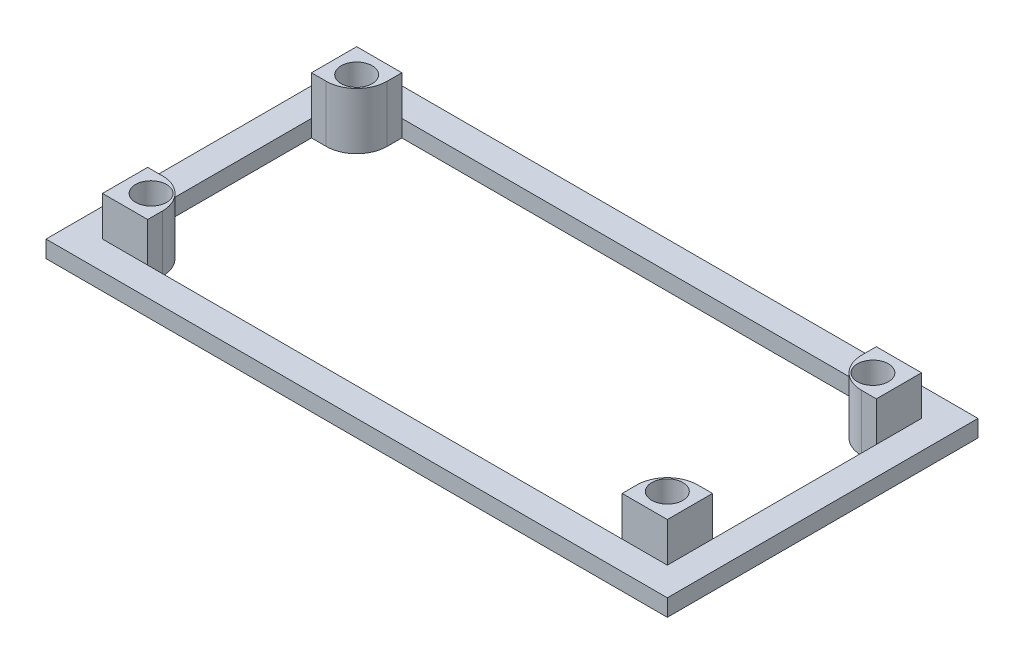
ISO-10303-21;
HEADER;
FILE_DESCRIPTION(('STEP AP214'),'2;1');
FILE_NAME('part.step','',(''),(''),'','','');
FILE_SCHEMA(('AUTOMOTIVE_DESIGN { 1 0 10303 214 1 1 1 1 }'));
ENDSEC;
DATA;
#1=APPLICATION_CONTEXT('core data for automotive mechanical design processes');
#2=APPLICATION_PROTOCOL_DEFINITION('international standard','automotive_design',2000,#1);
#3=PRODUCT_CONTEXT('',#1,'mechanical');
#4=PRODUCT('Part','Part','',(#3));
#5=PRODUCT_RELATED_PRODUCT_CATEGORY('part','',(#4));
#6=PRODUCT_DEFINITION_FORMATION('','',#4);
#7=PRODUCT_DEFINITION_CONTEXT('part definition',#1,'design');
#8=PRODUCT_DEFINITION('design','',#6,#7);
#9=PRODUCT_DEFINITION_SHAPE('','',#8);
#10=(LENGTH_UNIT() NAMED_UNIT(*) SI_UNIT(.MILLI.,.METRE.));
#11=(NAMED_UNIT(*) PLANE_ANGLE_UNIT() SI_UNIT($,.RADIAN.));
#12=(NAMED_UNIT(*) SI_UNIT($,.STERADIAN.) SOLID_ANGLE_UNIT());
#13=UNCERTAINTY_MEASURE_WITH_UNIT(LENGTH_MEASURE(1.E-05),#10,'distance_accuracy_value','');
#14=(GEOMETRIC_REPRESENTATION_CONTEXT(3) GLOBAL_UNCERTAINTY_ASSIGNED_CONTEXT((#13)) GLOBAL_UNIT_ASSIGNED_CONTEXT((#10,
#11,#12)) REPRESENTATION_CONTEXT('',''));
#15=CARTESIAN_POINT('',(0.,0.,0.));
#16=DIRECTION('',(0.,0.,1.));
#17=DIRECTION('',(1.,0.,0.));
#18=AXIS2_PLACEMENT_3D('',#15,#16,#17);
#19=CARTESIAN_POINT('',(-50.,3.,-22.5));
#20=DIRECTION('',(0.,0.,1.));
#21=DIRECTION('',(1.,0.,0.));
#22=AXIS2_PLACEMENT_3D('',#19,#20,#21);
#23=PLANE('',#22);
#24=DIRECTION('',(-1.,0.,0.));
#25=VECTOR('',#24,1.);
#26=CARTESIAN_POINT('',(-50.,0.,-22.5));
#27=LINE('',#26,#25);
#28=CARTESIAN_POINT('',(42.,0.,-22.5));
#29=VERTEX_POINT('',#28);
#30=CARTESIAN_POINT('',(-42.,0.,-22.5));
#31=VERTEX_POINT('',#30);
#32=EDGE_CURVE('E435',#29,#31,#27,.T.);
#33=ORIENTED_EDGE('',*,*,#32,.F.);
#34=DIRECTION('',(0.,1.,0.));
#35=VECTOR('',#34,1.);
#36=CARTESIAN_POINT('',(42.,-11.3137084989848,-22.5));
#37=LINE('',#36,#35);
#38=CARTESIAN_POINT('',(42.,3.,-22.5));
#39=VERTEX_POINT('',#38);
#40=EDGE_CURVE('E263',#29,#39,#37,.T.);
#41=ORIENTED_EDGE('',*,*,#40,.T.);
#42=DIRECTION('',(-1.,0.,0.));
#43=VECTOR('',#42,1.);
#44=CARTESIAN_POINT('',(-50.,3.,-22.5));
#45=LINE('',#44,#43);
#46=CARTESIAN_POINT('',(-42.,3.,-22.5));
#47=VERTEX_POINT('',#46);
#48=EDGE_CURVE('E419',#39,#47,#45,.T.);
#49=ORIENTED_EDGE('',*,*,#48,.T.);
#50=DIRECTION('',(0.,1.,0.));
#51=VECTOR('',#50,1.);
#52=CARTESIAN_POINT('',(-42.,-11.3137084989848,-22.5));
#53=LINE('',#52,#51);
#54=EDGE_CURVE('E313',#31,#47,#53,.T.);
#55=ORIENTED_EDGE('',*,*,#54,.F.);
#56=EDGE_LOOP('',(#33,#41,#49,#55));
#57=FACE_BOUND('',#56,.T.);
#58=ADVANCED_FACE('F39',(#57),#23,.T.);
#59=CARTESIAN_POINT('',(-50.,3.,22.5));
#60=DIRECTION('',(1.,0.,0.));
#61=DIRECTION('',(0.,0.,-1.));
#62=AXIS2_PLACEMENT_3D('',#59,#60,#61);
#63=PLANE('',#62);
#64=DIRECTION('',(0.,0.,1.));
#65=VECTOR('',#64,1.);
#66=CARTESIAN_POINT('',(-50.,0.,22.5));
#67=LINE('',#66,#65);
#68=CARTESIAN_POINT('',(-50.,0.,-14.5));
#69=VERTEX_POINT('',#68);
#70=CARTESIAN_POINT('',(-50.,0.,14.5));
#71=VERTEX_POINT('',#70);
#72=EDGE_CURVE('E432',#69,#71,#67,.T.);
#73=ORIENTED_EDGE('',*,*,#72,.F.);
#74=DIRECTION('',(0.,1.,0.));
#75=VECTOR('',#74,1.);
#76=CARTESIAN_POINT('',(-50.,-11.3137084989848,-14.5));
#77=LINE('',#76,#75);
#78=CARTESIAN_POINT('',(-50.,3.,-14.5));
#79=VERTEX_POINT('',#78);
#80=EDGE_CURVE('E317',#69,#79,#77,.T.);
#81=ORIENTED_EDGE('',*,*,#80,.T.);
#82=DIRECTION('',(0.,0.,1.));
#83=VECTOR('',#82,1.);
#84=CARTESIAN_POINT('',(-50.,3.,22.5));
#85=LINE('',#84,#83);
#86=CARTESIAN_POINT('',(-50.,3.,14.5));
#87=VERTEX_POINT('',#86);
#88=EDGE_CURVE('E422',#79,#87,#85,.T.);
#89=ORIENTED_EDGE('',*,*,#88,.T.);
#90=DIRECTION('',(0.,1.,0.));
#91=VECTOR('',#90,1.);
#92=CARTESIAN_POINT('',(-50.,-11.3137084989848,14.5));
#93=LINE('',#92,#91);
#94=EDGE_CURVE('E397',#71,#87,#93,.T.);
#95=ORIENTED_EDGE('',*,*,#94,.F.);
#96=EDGE_LOOP('',(#73,#81,#89,#95));
#97=FACE_BOUND('',#96,.T.);
#98=ADVANCED_FACE('F491',(#97),#63,.T.);
#99=CARTESIAN_POINT('',(50.,3.,22.5));
#100=DIRECTION('',(-1.,0.,0.));
#101=DIRECTION('',(0.,0.,1.));
#102=AXIS2_PLACEMENT_3D('',#99,#100,#101);
#103=PLANE('',#102);
#104=DIRECTION('',(0.,1.,0.));
#105=VECTOR('',#104,1.);
#106=CARTESIAN_POINT('',(50.,-11.3137084989848,-14.5));
#107=LINE('',#106,#105);
#108=CARTESIAN_POINT('',(50.,0.,-14.5));
#109=VERTEX_POINT('',#108);
#110=CARTESIAN_POINT('',(50.,3.,-14.5));
#111=VERTEX_POINT('',#110);
#112=EDGE_CURVE('E64',#109,#111,#107,.T.);
#113=ORIENTED_EDGE('',*,*,#112,.F.);
#114=DIRECTION('',(0.,0.,-1.));
#115=VECTOR('',#114,1.);
#116=CARTESIAN_POINT('',(50.,0.,22.5));
#117=LINE('',#116,#115);
#118=CARTESIAN_POINT('',(50.,0.,14.5));
#119=VERTEX_POINT('',#118);
#120=EDGE_CURVE('E386',#119,#109,#117,.T.);
#121=ORIENTED_EDGE('',*,*,#120,.F.);
#122=DIRECTION('',(0.,1.,0.));
#123=VECTOR('',#122,1.);
#124=CARTESIAN_POINT('',(50.,-11.3137084989848,14.5));
#125=LINE('',#124,#123);
#126=CARTESIAN_POINT('',(50.,3.,14.5));
#127=VERTEX_POINT('',#126);
#128=EDGE_CURVE('E361',#119,#127,#125,.T.);
#129=ORIENTED_EDGE('',*,*,#128,.T.);
#130=DIRECTION('',(0.,0.,-1.));
#131=VECTOR('',#130,1.);
#132=CARTESIAN_POINT('',(50.,3.,22.5));
#133=LINE('',#132,#131);
#134=EDGE_CURVE('E418',#127,#111,#133,.T.);
#135=ORIENTED_EDGE('',*,*,#134,.T.);
#136=EDGE_LOOP('',(#113,#121,#129,#135));
#137=FACE_BOUND('',#136,.T.);
#138=ADVANCED_FACE('F499',(#137),#103,.T.);
#139=CARTESIAN_POINT('',(-50.,3.,22.5));
#140=DIRECTION('',(0.,0.,-1.));
#141=DIRECTION('',(-1.,0.,0.));
#142=AXIS2_PLACEMENT_3D('',#139,#140,#141);
#143=PLANE('',#142);
#144=DIRECTION('',(0.,1.,0.));
#145=VECTOR('',#144,1.);
#146=CARTESIAN_POINT('',(42.,-11.3137084989848,22.5));
#147=LINE('',#146,#145);
#148=CARTESIAN_POINT('',(42.,0.,22.5));
#149=VERTEX_POINT('',#148);
#150=CARTESIAN_POINT('',(42.,3.,22.5));
#151=VERTEX_POINT('',#150);
#152=EDGE_CURVE('E352',#149,#151,#147,.T.);
#153=ORIENTED_EDGE('',*,*,#152,.F.);
#154=DIRECTION('',(1.,0.,0.));
#155=VECTOR('',#154,1.);
#156=CARTESIAN_POINT('',(-50.,0.,22.5));
#157=LINE('',#156,#155);
#158=CARTESIAN_POINT('',(-42.,0.,22.5));
#159=VERTEX_POINT('',#158);
#160=EDGE_CURVE('E436',#159,#149,#157,.T.);
#161=ORIENTED_EDGE('',*,*,#160,.F.);
#162=DIRECTION('',(0.,1.,0.));
#163=VECTOR('',#162,1.);
#164=CARTESIAN_POINT('',(-42.,-11.3137084989848,22.5));
#165=LINE('',#164,#163);
#166=CARTESIAN_POINT('',(-42.,3.,22.5));
#167=VERTEX_POINT('',#166);
#168=EDGE_CURVE('E388',#159,#167,#165,.T.);
#169=ORIENTED_EDGE('',*,*,#168,.T.);
#170=DIRECTION('',(1.,0.,0.));
#171=VECTOR('',#170,1.);
#172=CARTESIAN_POINT('',(-50.,3.,22.5));
#173=LINE('',#172,#171);
#174=EDGE_CURVE('E429',#167,#151,#173,.T.);
#175=ORIENTED_EDGE('',*,*,#174,.T.);
#176=EDGE_LOOP('',(#153,#161,#169,#175));
#177=FACE_BOUND('',#176,.T.);
#178=ADVANCED_FACE('F502',(#177),#143,.T.);
#179=CARTESIAN_POINT('',(0.,3.,0.));
#180=DIRECTION('',(0.,-1.,0.));
#181=DIRECTION('',(0.,0.,-1.));
#182=AXIS2_PLACEMENT_3D('',#179,#180,#181);
#183=PLANE('',#182);
#184=DIRECTION('',(0.,0.,1.));
#185=VECTOR('',#184,1.);
#186=CARTESIAN_POINT('',(-55.,3.,-27.5));
#187=LINE('',#186,#185);
#188=CARTESIAN_POINT('',(-55.,3.,-27.5));
#189=VERTEX_POINT('',#188);
#190=CARTESIAN_POINT('',(-55.,3.,27.5));
#191=VERTEX_POINT('',#190);
#192=EDGE_CURVE('E438',#189,#191,#187,.T.);
#193=ORIENTED_EDGE('',*,*,#192,.T.);
#194=DIRECTION('',(1.,0.,0.));
#195=VECTOR('',#194,1.);
#196=CARTESIAN_POINT('',(55.,3.,27.5));
#197=LINE('',#196,#195);
#198=CARTESIAN_POINT('',(55.,3.,27.5));
#199=VERTEX_POINT('',#198);
#200=EDGE_CURVE('E445',#191,#199,#197,.T.);
#201=ORIENTED_EDGE('',*,*,#200,.T.);
#202=DIRECTION('',(0.,0.,-1.));
#203=VECTOR('',#202,1.);
#204=CARTESIAN_POINT('',(55.,3.,-27.5));
#205=LINE('',#204,#203);
#206=CARTESIAN_POINT('',(55.,3.,-27.5));
#207=VERTEX_POINT('',#206);
#208=EDGE_CURVE('E443',#199,#207,#205,.T.);
#209=ORIENTED_EDGE('',*,*,#208,.T.);
#210=DIRECTION('',(-1.,0.,0.));
#211=VECTOR('',#210,1.);
#212=CARTESIAN_POINT('',(55.,3.,-27.5));
#213=LINE('',#212,#211);
#214=EDGE_CURVE('E446',#207,#189,#213,.T.);
#215=ORIENTED_EDGE('',*,*,#214,.T.);
#216=EDGE_LOOP('',(#193,#201,#209,#215));
#217=FACE_BOUND('',#216,.T.);
#218=CARTESIAN_POINT('',(50.,3.,22.5));
#219=VERTEX_POINT('',#218);
#220=EDGE_CURVE('E415',#219,#127,#133,.T.);
#221=ORIENTED_EDGE('',*,*,#220,.F.);
#222=EDGE_CURVE('E424',#151,#219,#173,.T.);
#223=ORIENTED_EDGE('',*,*,#222,.F.);
#224=ORIENTED_EDGE('',*,*,#174,.F.);
#225=CARTESIAN_POINT('',(-50.,3.,22.5));
#226=VERTEX_POINT('',#225);
#227=EDGE_CURVE('E426',#226,#167,#173,.T.);
#228=ORIENTED_EDGE('',*,*,#227,.F.);
#229=EDGE_CURVE('E420',#87,#226,#85,.T.);
#230=ORIENTED_EDGE('',*,*,#229,.F.);
#231=ORIENTED_EDGE('',*,*,#88,.F.);
#232=CARTESIAN_POINT('',(-50.,3.,-22.5));
#233=VERTEX_POINT('',#232);
#234=EDGE_CURVE('E423',#233,#79,#85,.T.);
#235=ORIENTED_EDGE('',*,*,#234,.F.);
#236=EDGE_CURVE('E414',#47,#233,#45,.T.);
#237=ORIENTED_EDGE('',*,*,#236,.F.);
#238=ORIENTED_EDGE('',*,*,#48,.F.);
#239=CARTESIAN_POINT('',(50.,3.,-22.5));
#240=VERTEX_POINT('',#239);
#241=EDGE_CURVE('E417',#240,#39,#45,.T.);
#242=ORIENTED_EDGE('',*,*,#241,.F.);
#243=EDGE_CURVE('E53',#111,#240,#133,.T.);
#244=ORIENTED_EDGE('',*,*,#243,.F.);
#245=ORIENTED_EDGE('',*,*,#134,.F.);
#246=EDGE_LOOP('',(#221,#223,#224,#228,#230,#231,#235,#237,#238,#242,#244,#245));
#247=FACE_BOUND('',#246,.T.);
#248=ADVANCED_FACE('F485',(#217,#247),#183,.F.);
#249=CARTESIAN_POINT('',(0.,0.,0.));
#250=DIRECTION('',(0.,-1.,0.));
#251=DIRECTION('',(0.,0.,-1.));
#252=AXIS2_PLACEMENT_3D('',#249,#250,#251);
#253=PLANE('',#252);
#254=ORIENTED_EDGE('',*,*,#120,.T.);
#255=DIRECTION('',(1.,0.,0.));
#256=VECTOR('',#255,1.);
#257=CARTESIAN_POINT('',(47.3899494936612,0.,-14.5));
#258=LINE('',#257,#256);
#259=CARTESIAN_POINT('',(47.3899494936612,0.,-14.5));
#260=VERTEX_POINT('',#259);
#261=EDGE_CURVE('E235',#260,#109,#258,.T.);
#262=ORIENTED_EDGE('',*,*,#261,.F.);
#263=CARTESIAN_POINT('',(47.3899494936612,0.,-19.8899494936612));
#264=DIRECTION('',(0.,-1.,0.));
#265=DIRECTION('',(0.,0.,-1.));
#266=AXIS2_PLACEMENT_3D('',#263,#264,#265);
#267=CIRCLE('',#266,5.38994949366117);
#268=CARTESIAN_POINT('',(42.,0.,-19.8899494936612));
#269=VERTEX_POINT('',#268);
#270=EDGE_CURVE('E270',#269,#260,#267,.F.);
#271=ORIENTED_EDGE('',*,*,#270,.F.);
#272=DIRECTION('',(0.,0.,1.));
#273=VECTOR('',#272,1.);
#274=CARTESIAN_POINT('',(42.,0.,-22.5));
#275=LINE('',#274,#273);
#276=EDGE_CURVE('E271',#29,#269,#275,.T.);
#277=ORIENTED_EDGE('',*,*,#276,.F.);
#278=ORIENTED_EDGE('',*,*,#32,.T.);
#279=DIRECTION('',(0.,0.,1.));
#280=VECTOR('',#279,1.);
#281=CARTESIAN_POINT('',(-42.,0.,-22.5));
#282=LINE('',#281,#280);
#283=CARTESIAN_POINT('',(-42.,0.,-19.8899494936612));
#284=VERTEX_POINT('',#283);
#285=EDGE_CURVE('E302',#31,#284,#282,.T.);
#286=ORIENTED_EDGE('',*,*,#285,.T.);
#287=CARTESIAN_POINT('',(-47.3899494936612,0.,-19.8899494936612));
#288=DIRECTION('',(0.,-1.,0.));
#289=DIRECTION('',(0.,0.,-1.));
#290=AXIS2_PLACEMENT_3D('',#287,#288,#289);
#291=CIRCLE('',#290,5.38994949366117);
#292=CARTESIAN_POINT('',(-47.3899494936612,0.,-14.5));
#293=VERTEX_POINT('',#292);
#294=EDGE_CURVE('E303',#284,#293,#291,.T.);
#295=ORIENTED_EDGE('',*,*,#294,.T.);
#296=DIRECTION('',(-1.,0.,0.));
#297=VECTOR('',#296,1.);
#298=CARTESIAN_POINT('',(-47.3899494936612,0.,-14.5));
#299=LINE('',#298,#297);
#300=EDGE_CURVE('E300',#293,#69,#299,.T.);
#301=ORIENTED_EDGE('',*,*,#300,.T.);
#302=ORIENTED_EDGE('',*,*,#72,.T.);
#303=DIRECTION('',(-1.,0.,0.));
#304=VECTOR('',#303,1.);
#305=CARTESIAN_POINT('',(-47.3899494936612,0.,14.5));
#306=LINE('',#305,#304);
#307=CARTESIAN_POINT('',(-47.3899494936612,0.,14.5));
#308=VERTEX_POINT('',#307);
#309=EDGE_CURVE('E394',#308,#71,#306,.T.);
#310=ORIENTED_EDGE('',*,*,#309,.F.);
#311=CARTESIAN_POINT('',(-47.3899494936612,0.,19.8899494936612));
#312=DIRECTION('',(0.,-1.,0.));
#313=DIRECTION('',(0.,0.,-1.));
#314=AXIS2_PLACEMENT_3D('',#311,#312,#313);
#315=CIRCLE('',#314,5.38994949366117);
#316=CARTESIAN_POINT('',(-42.,0.,19.8899494936612));
#317=VERTEX_POINT('',#316);
#318=EDGE_CURVE('E392',#317,#308,#315,.F.);
#319=ORIENTED_EDGE('',*,*,#318,.F.);
#320=DIRECTION('',(0.,0.,-1.));
#321=VECTOR('',#320,1.);
#322=CARTESIAN_POINT('',(-42.,0.,22.5));
#323=LINE('',#322,#321);
#324=EDGE_CURVE('E399',#159,#317,#323,.T.);
#325=ORIENTED_EDGE('',*,*,#324,.F.);
#326=ORIENTED_EDGE('',*,*,#160,.T.);
#327=DIRECTION('',(0.,0.,-1.));
#328=VECTOR('',#327,1.);
#329=CARTESIAN_POINT('',(42.,0.,22.5));
#330=LINE('',#329,#328);
#331=CARTESIAN_POINT('',(42.,0.,19.8899494936612));
#332=VERTEX_POINT('',#331);
#333=EDGE_CURVE('E346',#149,#332,#330,.T.);
#334=ORIENTED_EDGE('',*,*,#333,.T.);
#335=CARTESIAN_POINT('',(47.3899494936612,0.,19.8899494936612));
#336=DIRECTION('',(0.,-1.,0.));
#337=DIRECTION('',(0.,0.,-1.));
#338=AXIS2_PLACEMENT_3D('',#335,#336,#337);
#339=CIRCLE('',#338,5.38994949366117);
#340=CARTESIAN_POINT('',(47.3899494936612,0.,14.5));
#341=VERTEX_POINT('',#340);
#342=EDGE_CURVE('E344',#332,#341,#339,.T.);
#343=ORIENTED_EDGE('',*,*,#342,.T.);
#344=DIRECTION('',(1.,0.,0.));
#345=VECTOR('',#344,1.);
#346=CARTESIAN_POINT('',(47.3899494936612,0.,14.5));
#347=LINE('',#346,#345);
#348=EDGE_CURVE('E345',#341,#119,#347,.T.);
#349=ORIENTED_EDGE('',*,*,#348,.T.);
#350=EDGE_LOOP('',(#254,#262,#271,#277,#278,#286,#295,#301,#302,#310,#319,#325,#326,#334,#343,#349));
#351=FACE_BOUND('',#350,.T.);
#352=DIRECTION('',(0.,0.,1.));
#353=VECTOR('',#352,1.);
#354=CARTESIAN_POINT('',(-55.,0.,-27.5));
#355=LINE('',#354,#353);
#356=CARTESIAN_POINT('',(-55.,0.,-27.5));
#357=VERTEX_POINT('',#356);
#358=CARTESIAN_POINT('',(-55.,0.,27.5));
#359=VERTEX_POINT('',#358);
#360=EDGE_CURVE('E427',#357,#359,#355,.T.);
#361=ORIENTED_EDGE('',*,*,#360,.F.);
#362=DIRECTION('',(-1.,0.,0.));
#363=VECTOR('',#362,1.);
#364=CARTESIAN_POINT('',(55.,0.,-27.5));
#365=LINE('',#364,#363);
#366=CARTESIAN_POINT('',(55.,0.,-27.5));
#367=VERTEX_POINT('',#366);
#368=EDGE_CURVE('E444',#367,#357,#365,.T.);
#369=ORIENTED_EDGE('',*,*,#368,.F.);
#370=DIRECTION('',(0.,0.,-1.));
#371=VECTOR('',#370,1.);
#372=CARTESIAN_POINT('',(55.,0.,-27.5));
#373=LINE('',#372,#371);
#374=CARTESIAN_POINT('',(55.,0.,27.5));
#375=VERTEX_POINT('',#374);
#376=EDGE_CURVE('E452',#375,#367,#373,.T.);
#377=ORIENTED_EDGE('',*,*,#376,.F.);
#378=DIRECTION('',(1.,0.,0.));
#379=VECTOR('',#378,1.);
#380=CARTESIAN_POINT('',(55.,0.,27.5));
#381=LINE('',#380,#379);
#382=EDGE_CURVE('E455',#359,#375,#381,.T.);
#383=ORIENTED_EDGE('',*,*,#382,.F.);
#384=EDGE_LOOP('',(#361,#369,#377,#383));
#385=FACE_BOUND('',#384,.T.);
#386=CARTESIAN_POINT('',(-45.7,0.,18.2));
#387=DIRECTION('',(0.,-1.,0.));
#388=DIRECTION('',(0.,0.,-1.));
#389=AXIS2_PLACEMENT_3D('',#386,#387,#388);
#390=CIRCLE('',#389,2.75);
#391=CARTESIAN_POINT('',(-45.7,0.,15.45));
#392=VERTEX_POINT('',#391);
#393=EDGE_CURVE('E387',#392,#392,#390,.F.);
#394=ORIENTED_EDGE('',*,*,#393,.T.);
#395=EDGE_LOOP('',(#394));
#396=FACE_BOUND('',#395,.T.);
#397=CARTESIAN_POINT('',(45.7,0.,18.2));
#398=DIRECTION('',(0.,-1.,0.));
#399=DIRECTION('',(0.,0.,-1.));
#400=AXIS2_PLACEMENT_3D('',#397,#398,#399);
#401=CIRCLE('',#400,2.75);
#402=CARTESIAN_POINT('',(45.7,0.,15.45));
#403=VERTEX_POINT('',#402);
#404=EDGE_CURVE('E343',#403,#403,#401,.T.);
#405=ORIENTED_EDGE('',*,*,#404,.F.);
#406=EDGE_LOOP('',(#405));
#407=FACE_BOUND('',#406,.T.);
#408=CARTESIAN_POINT('',(-45.7,0.,-18.2));
#409=DIRECTION('',(0.,-1.,0.));
#410=DIRECTION('',(0.,0.,-1.));
#411=AXIS2_PLACEMENT_3D('',#408,#409,#410);
#412=CIRCLE('',#411,2.75);
#413=CARTESIAN_POINT('',(-45.7,0.,-20.95));
#414=VERTEX_POINT('',#413);
#415=EDGE_CURVE('E296',#414,#414,#412,.T.);
#416=ORIENTED_EDGE('',*,*,#415,.F.);
#417=EDGE_LOOP('',(#416));
#418=FACE_BOUND('',#417,.T.);
#419=CARTESIAN_POINT('',(45.7,0.,-18.2));
#420=DIRECTION('',(0.,-1.,0.));
#421=DIRECTION('',(0.,0.,-1.));
#422=AXIS2_PLACEMENT_3D('',#419,#420,#421);
#423=CIRCLE('',#422,2.75);
#424=CARTESIAN_POINT('',(45.7,0.,-20.95));
#425=VERTEX_POINT('',#424);
#426=EDGE_CURVE('E259',#425,#425,#423,.F.);
#427=ORIENTED_EDGE('',*,*,#426,.T.);
#428=EDGE_LOOP('',(#427));
#429=FACE_BOUND('',#428,.T.);
#430=ADVANCED_FACE('F472',(#351,#385,#396,#407,#418,#429),#253,.T.);
#431=CARTESIAN_POINT('',(-55.,3.,-27.5));
#432=DIRECTION('',(1.,0.,0.));
#433=DIRECTION('',(0.,0.,-1.));
#434=AXIS2_PLACEMENT_3D('',#431,#432,#433);
#435=PLANE('',#434);
#436=ORIENTED_EDGE('',*,*,#360,.T.);
#437=DIRECTION('',(0.,-1.,0.));
#438=VECTOR('',#437,1.);
#439=CARTESIAN_POINT('',(-55.,3.,27.5));
#440=LINE('',#439,#438);
#441=EDGE_CURVE('E11',#191,#359,#440,.T.);
#442=ORIENTED_EDGE('',*,*,#441,.F.);
#443=ORIENTED_EDGE('',*,*,#192,.F.);
#444=DIRECTION('',(0.,-1.,0.));
#445=VECTOR('',#444,1.);
#446=CARTESIAN_POINT('',(-55.,3.,-27.5));
#447=LINE('',#446,#445);
#448=EDGE_CURVE('E448',#189,#357,#447,.T.);
#449=ORIENTED_EDGE('',*,*,#448,.T.);
#450=EDGE_LOOP('',(#436,#442,#443,#449));
#451=FACE_BOUND('',#450,.T.);
#452=ADVANCED_FACE('F41',(#451),#435,.F.);
#453=CARTESIAN_POINT('',(55.,3.,27.5));
#454=DIRECTION('',(0.,0.,-1.));
#455=DIRECTION('',(-1.,0.,0.));
#456=AXIS2_PLACEMENT_3D('',#453,#454,#455);
#457=PLANE('',#456);
#458=ORIENTED_EDGE('',*,*,#382,.T.);
#459=DIRECTION('',(0.,-1.,0.));
#460=VECTOR('',#459,1.);
#461=CARTESIAN_POINT('',(55.,3.,27.5));
#462=LINE('',#461,#460);
#463=EDGE_CURVE('E50',#199,#375,#462,.T.);
#464=ORIENTED_EDGE('',*,*,#463,.F.);
#465=ORIENTED_EDGE('',*,*,#200,.F.);
#466=ORIENTED_EDGE('',*,*,#441,.T.);
#467=EDGE_LOOP('',(#458,#464,#465,#466));
#468=FACE_BOUND('',#467,.T.);
#469=ADVANCED_FACE('F483',(#468),#457,.F.);
#470=CARTESIAN_POINT('',(55.,3.,-27.5));
#471=DIRECTION('',(-1.,0.,0.));
#472=DIRECTION('',(0.,0.,1.));
#473=AXIS2_PLACEMENT_3D('',#470,#471,#472);
#474=PLANE('',#473);
#475=ORIENTED_EDGE('',*,*,#376,.T.);
#476=DIRECTION('',(0.,-1.,0.));
#477=VECTOR('',#476,1.);
#478=CARTESIAN_POINT('',(55.,3.,-27.5));
#479=LINE('',#478,#477);
#480=EDGE_CURVE('E459',#207,#367,#479,.T.);
#481=ORIENTED_EDGE('',*,*,#480,.F.);
#482=ORIENTED_EDGE('',*,*,#208,.F.);
#483=ORIENTED_EDGE('',*,*,#463,.T.);
#484=EDGE_LOOP('',(#475,#481,#482,#483));
#485=FACE_BOUND('',#484,.T.);
#486=ADVANCED_FACE('F468',(#485),#474,.F.);
#487=CARTESIAN_POINT('',(55.,3.,-27.5));
#488=DIRECTION('',(0.,0.,1.));
#489=DIRECTION('',(1.,0.,0.));
#490=AXIS2_PLACEMENT_3D('',#487,#488,#489);
#491=PLANE('',#490);
#492=ORIENTED_EDGE('',*,*,#368,.T.);
#493=ORIENTED_EDGE('',*,*,#448,.F.);
#494=ORIENTED_EDGE('',*,*,#214,.F.);
#495=ORIENTED_EDGE('',*,*,#480,.T.);
#496=EDGE_LOOP('',(#492,#493,#494,#495));
#497=FACE_BOUND('',#496,.T.);
#498=ADVANCED_FACE('F478',(#497),#491,.F.);
#499=CARTESIAN_POINT('',(-50.,-11.3137084989848,14.5));
#500=DIRECTION('',(-1.,0.,0.));
#501=DIRECTION('',(0.,0.,1.));
#502=AXIS2_PLACEMENT_3D('',#499,#500,#501);
#503=PLANE('',#502);
#504=ORIENTED_EDGE('',*,*,#229,.T.);
#505=DIRECTION('',(0.,1.,0.));
#506=VECTOR('',#505,1.);
#507=CARTESIAN_POINT('',(-50.,-11.3137084989848,22.5));
#508=LINE('',#507,#506);
#509=CARTESIAN_POINT('',(-50.,10.,22.5));
#510=VERTEX_POINT('',#509);
#511=EDGE_CURVE('E384',#226,#510,#508,.T.);
#512=ORIENTED_EDGE('',*,*,#511,.T.);
#513=DIRECTION('',(0.,0.,1.));
#514=VECTOR('',#513,1.);
#515=CARTESIAN_POINT('',(-50.,10.,14.5));
#516=LINE('',#515,#514);
#517=CARTESIAN_POINT('',(-50.,10.,14.5));
#518=VERTEX_POINT('',#517);
#519=EDGE_CURVE('E367',#518,#510,#516,.T.);
#520=ORIENTED_EDGE('',*,*,#519,.F.);
#521=EDGE_CURVE('E393',#87,#518,#93,.T.);
#522=ORIENTED_EDGE('',*,*,#521,.F.);
#523=EDGE_LOOP('',(#504,#512,#520,#522));
#524=FACE_BOUND('',#523,.T.);
#525=ADVANCED_FACE('F515',(#524),#503,.T.);
#526=CARTESIAN_POINT('',(-50.,-11.3137084989848,22.5));
#527=DIRECTION('',(0.,0.,1.));
#528=DIRECTION('',(1.,0.,0.));
#529=AXIS2_PLACEMENT_3D('',#526,#527,#528);
#530=PLANE('',#529);
#531=ORIENTED_EDGE('',*,*,#227,.T.);
#532=CARTESIAN_POINT('',(-42.,10.,22.5));
#533=VERTEX_POINT('',#532);
#534=EDGE_CURVE('E410',#167,#533,#165,.T.);
#535=ORIENTED_EDGE('',*,*,#534,.T.);
#536=DIRECTION('',(1.,0.,0.));
#537=VECTOR('',#536,1.);
#538=CARTESIAN_POINT('',(-50.,10.,22.5));
#539=LINE('',#538,#537);
#540=EDGE_CURVE('E373',#510,#533,#539,.T.);
#541=ORIENTED_EDGE('',*,*,#540,.F.);
#542=ORIENTED_EDGE('',*,*,#511,.F.);
#543=EDGE_LOOP('',(#531,#535,#541,#542));
#544=FACE_BOUND('',#543,.T.);
#545=ADVANCED_FACE('F519',(#544),#530,.T.);
#546=CARTESIAN_POINT('',(-47.3899494936612,-11.3137084989848,14.5));
#547=DIRECTION('',(0.,0.,-1.));
#548=DIRECTION('',(-1.,0.,0.));
#549=AXIS2_PLACEMENT_3D('',#546,#547,#548);
#550=PLANE('',#549);
#551=DIRECTION('',(0.,1.,0.));
#552=VECTOR('',#551,1.);
#553=CARTESIAN_POINT('',(-47.3899494936612,-11.3137084989848,14.5));
#554=LINE('',#553,#552);
#555=CARTESIAN_POINT('',(-47.3899494936612,10.,14.5));
#556=VERTEX_POINT('',#555);
#557=EDGE_CURVE('E396',#308,#556,#554,.T.);
#558=ORIENTED_EDGE('',*,*,#557,.F.);
#559=ORIENTED_EDGE('',*,*,#309,.T.);
#560=ORIENTED_EDGE('',*,*,#94,.T.);
#561=ORIENTED_EDGE('',*,*,#521,.T.);
#562=DIRECTION('',(-1.,0.,0.));
#563=VECTOR('',#562,1.);
#564=CARTESIAN_POINT('',(-47.3899494936612,10.,14.5));
#565=LINE('',#564,#563);
#566=EDGE_CURVE('E385',#556,#518,#565,.T.);
#567=ORIENTED_EDGE('',*,*,#566,.F.);
#568=EDGE_LOOP('',(#558,#559,#560,#561,#567));
#569=FACE_BOUND('',#568,.T.);
#570=ADVANCED_FACE('F525',(#569),#550,.T.);
#571=CARTESIAN_POINT('',(-47.3899494936612,-11.3137084989848,19.8899494936612));
#572=DIRECTION('',(0.,1.,0.));
#573=DIRECTION('',(0.,0.,1.));
#574=AXIS2_PLACEMENT_3D('',#571,#572,#573);
#575=CYLINDRICAL_SURFACE('',#574,5.38994949366117);
#576=DIRECTION('',(0.,1.,0.));
#577=VECTOR('',#576,1.);
#578=CARTESIAN_POINT('',(-42.,-11.3137084989848,19.8899494936612));
#579=LINE('',#578,#577);
#580=CARTESIAN_POINT('',(-42.,10.,19.8899494936612));
#581=VERTEX_POINT('',#580);
#582=EDGE_CURVE('E401',#317,#581,#579,.T.);
#583=ORIENTED_EDGE('',*,*,#582,.F.);
#584=ORIENTED_EDGE('',*,*,#318,.T.);
#585=ORIENTED_EDGE('',*,*,#557,.T.);
#586=CARTESIAN_POINT('',(-47.3899494936612,10.,19.8899494936612));
#587=DIRECTION('',(0.,1.,0.));
#588=DIRECTION('',(0.,0.,1.));
#589=AXIS2_PLACEMENT_3D('',#586,#587,#588);
#590=CIRCLE('',#589,5.38994949366117);
#591=EDGE_CURVE('E377',#581,#556,#590,.T.);
#592=ORIENTED_EDGE('',*,*,#591,.F.);
#593=EDGE_LOOP('',(#583,#584,#585,#592));
#594=FACE_BOUND('',#593,.T.);
#595=ADVANCED_FACE('F607',(#594),#575,.T.);
#596=CARTESIAN_POINT('',(-42.,-11.3137084989848,22.5));
#597=DIRECTION('',(1.,0.,0.));
#598=DIRECTION('',(0.,0.,-1.));
#599=AXIS2_PLACEMENT_3D('',#596,#597,#598);
#600=PLANE('',#599);
#601=ORIENTED_EDGE('',*,*,#168,.F.);
#602=ORIENTED_EDGE('',*,*,#324,.T.);
#603=ORIENTED_EDGE('',*,*,#582,.T.);
#604=DIRECTION('',(0.,0.,-1.));
#605=VECTOR('',#604,1.);
#606=CARTESIAN_POINT('',(-42.,10.,22.5));
#607=LINE('',#606,#605);
#608=EDGE_CURVE('E376',#533,#581,#607,.T.);
#609=ORIENTED_EDGE('',*,*,#608,.F.);
#610=ORIENTED_EDGE('',*,*,#534,.F.);
#611=EDGE_LOOP('',(#601,#602,#603,#609,#610));
#612=FACE_BOUND('',#611,.T.);
#613=ADVANCED_FACE('F535',(#612),#600,.T.);
#614=CARTESIAN_POINT('',(-45.7,-11.3137084989848,18.2));
#615=DIRECTION('',(0.,1.,0.));
#616=DIRECTION('',(0.,0.,1.));
#617=AXIS2_PLACEMENT_3D('',#614,#615,#616);
#618=CYLINDRICAL_SURFACE('',#617,2.75);
#619=ORIENTED_EDGE('',*,*,#393,.F.);
#620=EDGE_LOOP('',(#619));
#621=FACE_BOUND('',#620,.T.);
#622=CARTESIAN_POINT('',(-45.7,10.,18.2));
#623=DIRECTION('',(0.,1.,0.));
#624=DIRECTION('',(0.,0.,1.));
#625=AXIS2_PLACEMENT_3D('',#622,#623,#624);
#626=CIRCLE('',#625,2.75);
#627=CARTESIAN_POINT('',(-45.7,10.,20.95));
#628=VERTEX_POINT('',#627);
#629=EDGE_CURVE('E353',#628,#628,#626,.T.);
#630=ORIENTED_EDGE('',*,*,#629,.T.);
#631=EDGE_LOOP('',(#630));
#632=FACE_BOUND('',#631,.T.);
#633=ADVANCED_FACE('F530',(#621,#632),#618,.F.);
#634=CARTESIAN_POINT('',(-47.3899494936612,10.,19.8899494936612));
#635=DIRECTION('',(0.,1.,0.));
#636=DIRECTION('',(0.,0.,1.));
#637=AXIS2_PLACEMENT_3D('',#634,#635,#636);
#638=PLANE('',#637);
#639=ORIENTED_EDGE('',*,*,#519,.T.);
#640=ORIENTED_EDGE('',*,*,#540,.T.);
#641=ORIENTED_EDGE('',*,*,#608,.T.);
#642=ORIENTED_EDGE('',*,*,#591,.T.);
#643=ORIENTED_EDGE('',*,*,#566,.T.);
#644=EDGE_LOOP('',(#639,#640,#641,#642,#643));
#645=FACE_BOUND('',#644,.T.);
#646=ORIENTED_EDGE('',*,*,#629,.F.);
#647=EDGE_LOOP('',(#646));
#648=FACE_BOUND('',#647,.T.);
#649=ADVANCED_FACE('F533',(#645,#648),#638,.T.);
#650=CARTESIAN_POINT('',(50.,-11.3137084989848,22.5));
#651=DIRECTION('',(0.,0.,-1.));
#652=DIRECTION('',(-1.,0.,0.));
#653=AXIS2_PLACEMENT_3D('',#650,#651,#652);
#654=PLANE('',#653);
#655=CARTESIAN_POINT('',(42.,10.,22.5));
#656=VERTEX_POINT('',#655);
#657=EDGE_CURVE('E356',#151,#656,#147,.T.);
#658=ORIENTED_EDGE('',*,*,#657,.F.);
#659=ORIENTED_EDGE('',*,*,#222,.T.);
#660=DIRECTION('',(0.,1.,0.));
#661=VECTOR('',#660,1.);
#662=CARTESIAN_POINT('',(50.,-11.3137084989848,22.5));
#663=LINE('',#662,#661);
#664=CARTESIAN_POINT('',(50.,10.,22.5));
#665=VERTEX_POINT('',#664);
#666=EDGE_CURVE('E351',#219,#665,#663,.T.);
#667=ORIENTED_EDGE('',*,*,#666,.T.);
#668=DIRECTION('',(-1.,0.,0.));
#669=VECTOR('',#668,1.);
#670=CARTESIAN_POINT('',(50.,10.,22.5));
#671=LINE('',#670,#669);
#672=EDGE_CURVE('E340',#665,#656,#671,.T.);
#673=ORIENTED_EDGE('',*,*,#672,.T.);
#674=EDGE_LOOP('',(#658,#659,#667,#673));
#675=FACE_BOUND('',#674,.T.);
#676=ADVANCED_FACE('F618',(#675),#654,.F.);
#677=CARTESIAN_POINT('',(50.,-11.3137084989848,14.5));
#678=DIRECTION('',(-1.,0.,0.));
#679=DIRECTION('',(0.,0.,1.));
#680=AXIS2_PLACEMENT_3D('',#677,#678,#679);
#681=PLANE('',#680);
#682=ORIENTED_EDGE('',*,*,#666,.F.);
#683=ORIENTED_EDGE('',*,*,#220,.T.);
#684=CARTESIAN_POINT('',(50.,10.,14.5));
#685=VERTEX_POINT('',#684);
#686=EDGE_CURVE('E354',#127,#685,#125,.T.);
#687=ORIENTED_EDGE('',*,*,#686,.T.);
#688=DIRECTION('',(0.,0.,1.));
#689=VECTOR('',#688,1.);
#690=CARTESIAN_POINT('',(50.,10.,14.5));
#691=LINE('',#690,#689);
#692=EDGE_CURVE('E326',#685,#665,#691,.T.);
#693=ORIENTED_EDGE('',*,*,#692,.T.);
#694=EDGE_LOOP('',(#682,#683,#687,#693));
#695=FACE_BOUND('',#694,.T.);
#696=ADVANCED_FACE('F621',(#695),#681,.F.);
#697=CARTESIAN_POINT('',(47.3899494936612,-11.3137084989848,14.5));
#698=DIRECTION('',(0.,0.,1.));
#699=DIRECTION('',(1.,0.,0.));
#700=AXIS2_PLACEMENT_3D('',#697,#698,#699);
#701=PLANE('',#700);
#702=ORIENTED_EDGE('',*,*,#348,.F.);
#703=DIRECTION('',(0.,1.,0.));
#704=VECTOR('',#703,1.);
#705=CARTESIAN_POINT('',(47.3899494936612,-11.3137084989848,14.5));
#706=LINE('',#705,#704);
#707=CARTESIAN_POINT('',(47.3899494936612,10.,14.5));
#708=VERTEX_POINT('',#707);
#709=EDGE_CURVE('E363',#341,#708,#706,.T.);
#710=ORIENTED_EDGE('',*,*,#709,.T.);
#711=DIRECTION('',(1.,0.,0.));
#712=VECTOR('',#711,1.);
#713=CARTESIAN_POINT('',(47.3899494936612,10.,14.5));
#714=LINE('',#713,#712);
#715=EDGE_CURVE('E328',#708,#685,#714,.T.);
#716=ORIENTED_EDGE('',*,*,#715,.T.);
#717=ORIENTED_EDGE('',*,*,#686,.F.);
#718=ORIENTED_EDGE('',*,*,#128,.F.);
#719=EDGE_LOOP('',(#702,#710,#716,#717,#718));
#720=FACE_BOUND('',#719,.T.);
#721=ADVANCED_FACE('F560',(#720),#701,.F.);
#722=CARTESIAN_POINT('',(47.3899494936612,-11.3137084989848,19.8899494936612));
#723=DIRECTION('',(0.,1.,0.));
#724=DIRECTION('',(0.,0.,1.));
#725=AXIS2_PLACEMENT_3D('',#722,#723,#724);
#726=CYLINDRICAL_SURFACE('',#725,5.38994949366117);
#727=ORIENTED_EDGE('',*,*,#342,.F.);
#728=DIRECTION('',(0.,1.,0.));
#729=VECTOR('',#728,1.);
#730=CARTESIAN_POINT('',(42.,-11.3137084989848,19.8899494936612));
#731=LINE('',#730,#729);
#732=CARTESIAN_POINT('',(42.,10.,19.8899494936612));
#733=VERTEX_POINT('',#732);
#734=EDGE_CURVE('E357',#332,#733,#731,.T.);
#735=ORIENTED_EDGE('',*,*,#734,.T.);
#736=CARTESIAN_POINT('',(47.3899494936612,10.,19.8899494936612));
#737=DIRECTION('',(0.,-1.,0.));
#738=DIRECTION('',(0.,0.,1.));
#739=AXIS2_PLACEMENT_3D('',#736,#737,#738);
#740=CIRCLE('',#739,5.38994949366117);
#741=EDGE_CURVE('E335',#733,#708,#740,.T.);
#742=ORIENTED_EDGE('',*,*,#741,.T.);
#743=ORIENTED_EDGE('',*,*,#709,.F.);
#744=EDGE_LOOP('',(#727,#735,#742,#743));
#745=FACE_BOUND('',#744,.T.);
#746=ADVANCED_FACE('F548',(#745),#726,.T.);
#747=CARTESIAN_POINT('',(42.,-11.3137084989848,22.5));
#748=DIRECTION('',(1.,0.,0.));
#749=DIRECTION('',(0.,0.,-1.));
#750=AXIS2_PLACEMENT_3D('',#747,#748,#749);
#751=PLANE('',#750);
#752=ORIENTED_EDGE('',*,*,#333,.F.);
#753=ORIENTED_EDGE('',*,*,#152,.T.);
#754=ORIENTED_EDGE('',*,*,#657,.T.);
#755=DIRECTION('',(0.,0.,-1.));
#756=VECTOR('',#755,1.);
#757=CARTESIAN_POINT('',(42.,10.,22.5));
#758=LINE('',#757,#756);
#759=EDGE_CURVE('E333',#656,#733,#758,.T.);
#760=ORIENTED_EDGE('',*,*,#759,.T.);
#761=ORIENTED_EDGE('',*,*,#734,.F.);
#762=EDGE_LOOP('',(#752,#753,#754,#760,#761));
#763=FACE_BOUND('',#762,.T.);
#764=ADVANCED_FACE('F544',(#763),#751,.F.);
#765=CARTESIAN_POINT('',(45.7,-11.3137084989848,18.2));
#766=DIRECTION('',(0.,1.,0.));
#767=DIRECTION('',(0.,0.,1.));
#768=AXIS2_PLACEMENT_3D('',#765,#766,#767);
#769=CYLINDRICAL_SURFACE('',#768,2.75);
#770=ORIENTED_EDGE('',*,*,#404,.T.);
#771=EDGE_LOOP('',(#770));
#772=FACE_BOUND('',#771,.T.);
#773=CARTESIAN_POINT('',(45.7,10.,18.2));
#774=DIRECTION('',(0.,-1.,0.));
#775=DIRECTION('',(0.,0.,1.));
#776=AXIS2_PLACEMENT_3D('',#773,#774,#775);
#777=CIRCLE('',#776,2.75);
#778=CARTESIAN_POINT('',(45.7,10.,20.95));
#779=VERTEX_POINT('',#778);
#780=EDGE_CURVE('E309',#779,#779,#777,.T.);
#781=ORIENTED_EDGE('',*,*,#780,.F.);
#782=EDGE_LOOP('',(#781));
#783=FACE_BOUND('',#782,.T.);
#784=ADVANCED_FACE('F722',(#772,#783),#769,.F.);
#785=CARTESIAN_POINT('',(47.3899494936612,10.,19.8899494936612));
#786=DIRECTION('',(0.,1.,0.));
#787=DIRECTION('',(0.,0.,1.));
#788=AXIS2_PLACEMENT_3D('',#785,#786,#787);
#789=PLANE('',#788);
#790=ORIENTED_EDGE('',*,*,#780,.T.);
#791=EDGE_LOOP('',(#790));
#792=FACE_BOUND('',#791,.T.);
#793=ORIENTED_EDGE('',*,*,#692,.F.);
#794=ORIENTED_EDGE('',*,*,#715,.F.);
#795=ORIENTED_EDGE('',*,*,#741,.F.);
#796=ORIENTED_EDGE('',*,*,#759,.F.);
#797=ORIENTED_EDGE('',*,*,#672,.F.);
#798=EDGE_LOOP('',(#793,#794,#795,#796,#797));
#799=FACE_BOUND('',#798,.T.);
#800=ADVANCED_FACE('F554',(#792,#799),#789,.T.);
#801=CARTESIAN_POINT('',(-50.,-11.3137084989848,-22.5));
#802=DIRECTION('',(0.,0.,1.));
#803=DIRECTION('',(1.,0.,0.));
#804=AXIS2_PLACEMENT_3D('',#801,#802,#803);
#805=PLANE('',#804);
#806=CARTESIAN_POINT('',(-42.,10.,-22.5));
#807=VERTEX_POINT('',#806);
#808=EDGE_CURVE('E314',#47,#807,#53,.T.);
#809=ORIENTED_EDGE('',*,*,#808,.F.);
#810=ORIENTED_EDGE('',*,*,#236,.T.);
#811=DIRECTION('',(0.,1.,0.));
#812=VECTOR('',#811,1.);
#813=CARTESIAN_POINT('',(-50.,-11.3137084989848,-22.5));
#814=LINE('',#813,#812);
#815=CARTESIAN_POINT('',(-50.,10.,-22.5));
#816=VERTEX_POINT('',#815);
#817=EDGE_CURVE('E306',#233,#816,#814,.T.);
#818=ORIENTED_EDGE('',*,*,#817,.T.);
#819=DIRECTION('',(1.,0.,0.));
#820=VECTOR('',#819,1.);
#821=CARTESIAN_POINT('',(-50.,10.,-22.5));
#822=LINE('',#821,#820);
#823=EDGE_CURVE('E294',#816,#807,#822,.T.);
#824=ORIENTED_EDGE('',*,*,#823,.T.);
#825=EDGE_LOOP('',(#809,#810,#818,#824));
#826=FACE_BOUND('',#825,.T.);
#827=ADVANCED_FACE('F580',(#826),#805,.F.);
#828=CARTESIAN_POINT('',(-50.,-11.3137084989848,-14.5));
#829=DIRECTION('',(1.,0.,0.));
#830=DIRECTION('',(0.,0.,-1.));
#831=AXIS2_PLACEMENT_3D('',#828,#829,#830);
#832=PLANE('',#831);
#833=ORIENTED_EDGE('',*,*,#817,.F.);
#834=ORIENTED_EDGE('',*,*,#234,.T.);
#835=CARTESIAN_POINT('',(-50.,10.,-14.5));
#836=VERTEX_POINT('',#835);
#837=EDGE_CURVE('E307',#79,#836,#77,.T.);
#838=ORIENTED_EDGE('',*,*,#837,.T.);
#839=DIRECTION('',(0.,0.,-1.));
#840=VECTOR('',#839,1.);
#841=CARTESIAN_POINT('',(-50.,10.,-14.5));
#842=LINE('',#841,#840);
#843=EDGE_CURVE('E281',#836,#816,#842,.T.);
#844=ORIENTED_EDGE('',*,*,#843,.T.);
#845=EDGE_LOOP('',(#833,#834,#838,#844));
#846=FACE_BOUND('',#845,.T.);
#847=ADVANCED_FACE('F577',(#846),#832,.F.);
#848=CARTESIAN_POINT('',(-47.3899494936612,-11.3137084989848,-14.5));
#849=DIRECTION('',(0.,0.,-1.));
#850=DIRECTION('',(-1.,0.,0.));
#851=AXIS2_PLACEMENT_3D('',#848,#849,#850);
#852=PLANE('',#851);
#853=ORIENTED_EDGE('',*,*,#300,.F.);
#854=DIRECTION('',(0.,1.,0.));
#855=VECTOR('',#854,1.);
#856=CARTESIAN_POINT('',(-47.3899494936612,-11.3137084989848,-14.5));
#857=LINE('',#856,#855);
#858=CARTESIAN_POINT('',(-47.3899494936612,10.,-14.5));
#859=VERTEX_POINT('',#858);
#860=EDGE_CURVE('E320',#293,#859,#857,.T.);
#861=ORIENTED_EDGE('',*,*,#860,.T.);
#862=DIRECTION('',(-1.,0.,0.));
#863=VECTOR('',#862,1.);
#864=CARTESIAN_POINT('',(-47.3899494936612,10.,-14.5));
#865=LINE('',#864,#863);
#866=EDGE_CURVE('E282',#859,#836,#865,.T.);
#867=ORIENTED_EDGE('',*,*,#866,.T.);
#868=ORIENTED_EDGE('',*,*,#837,.F.);
#869=ORIENTED_EDGE('',*,*,#80,.F.);
#870=EDGE_LOOP('',(#853,#861,#867,#868,#869));
#871=FACE_BOUND('',#870,.T.);
#872=ADVANCED_FACE('F600',(#871),#852,.F.);
#873=CARTESIAN_POINT('',(-47.3899494936612,-11.3137084989848,-19.8899494936612));
#874=DIRECTION('',(0.,1.,0.));
#875=DIRECTION('',(0.,0.,1.));
#876=AXIS2_PLACEMENT_3D('',#873,#874,#875);
#877=CYLINDRICAL_SURFACE('',#876,5.38994949366117);
#878=ORIENTED_EDGE('',*,*,#294,.F.);
#879=DIRECTION('',(0.,1.,0.));
#880=VECTOR('',#879,1.);
#881=CARTESIAN_POINT('',(-42.,-11.3137084989848,-19.8899494936612));
#882=LINE('',#881,#880);
#883=CARTESIAN_POINT('',(-42.,10.,-19.8899494936612));
#884=VERTEX_POINT('',#883);
#885=EDGE_CURVE('E312',#284,#884,#882,.T.);
#886=ORIENTED_EDGE('',*,*,#885,.T.);
#887=CARTESIAN_POINT('',(-47.3899494936612,10.,-19.8899494936612));
#888=DIRECTION('',(0.,-1.,0.));
#889=DIRECTION('',(0.,0.,-1.));
#890=AXIS2_PLACEMENT_3D('',#887,#888,#889);
#891=CIRCLE('',#890,5.38994949366117);
#892=EDGE_CURVE('E286',#884,#859,#891,.T.);
#893=ORIENTED_EDGE('',*,*,#892,.T.);
#894=ORIENTED_EDGE('',*,*,#860,.F.);
#895=EDGE_LOOP('',(#878,#886,#893,#894));
#896=FACE_BOUND('',#895,.T.);
#897=ADVANCED_FACE('F592',(#896),#877,.T.);
#898=CARTESIAN_POINT('',(-42.,-11.3137084989848,-22.5));
#899=DIRECTION('',(-1.,0.,0.));
#900=DIRECTION('',(0.,0.,1.));
#901=AXIS2_PLACEMENT_3D('',#898,#899,#900);
#902=PLANE('',#901);
#903=ORIENTED_EDGE('',*,*,#285,.F.);
#904=ORIENTED_EDGE('',*,*,#54,.T.);
#905=ORIENTED_EDGE('',*,*,#808,.T.);
#906=DIRECTION('',(0.,0.,1.));
#907=VECTOR('',#906,1.);
#908=CARTESIAN_POINT('',(-42.,10.,-22.5));
#909=LINE('',#908,#907);
#910=EDGE_CURVE('E292',#807,#884,#909,.T.);
#911=ORIENTED_EDGE('',*,*,#910,.T.);
#912=ORIENTED_EDGE('',*,*,#885,.F.);
#913=EDGE_LOOP('',(#903,#904,#905,#911,#912));
#914=FACE_BOUND('',#913,.T.);
#915=ADVANCED_FACE('F591',(#914),#902,.F.);
#916=CARTESIAN_POINT('',(-45.7,-11.3137084989848,-18.2));
#917=DIRECTION('',(0.,1.,0.));
#918=DIRECTION('',(0.,0.,1.));
#919=AXIS2_PLACEMENT_3D('',#916,#917,#918);
#920=CYLINDRICAL_SURFACE('',#919,2.75);
#921=ORIENTED_EDGE('',*,*,#415,.T.);
#922=EDGE_LOOP('',(#921));
#923=FACE_BOUND('',#922,.T.);
#924=CARTESIAN_POINT('',(-45.7,10.,-18.2));
#925=DIRECTION('',(0.,-1.,0.));
#926=DIRECTION('',(0.,0.,-1.));
#927=AXIS2_PLACEMENT_3D('',#924,#925,#926);
#928=CIRCLE('',#927,2.75);
#929=CARTESIAN_POINT('',(-45.7,10.,-20.95));
#930=VERTEX_POINT('',#929);
#931=EDGE_CURVE('E265',#930,#930,#928,.T.);
#932=ORIENTED_EDGE('',*,*,#931,.F.);
#933=EDGE_LOOP('',(#932));
#934=FACE_BOUND('',#933,.T.);
#935=ADVANCED_FACE('F776',(#923,#934),#920,.F.);
#936=CARTESIAN_POINT('',(-47.3899494936612,10.,-19.8899494936612));
#937=DIRECTION('',(0.,1.,0.));
#938=DIRECTION('',(0.,0.,-1.));
#939=AXIS2_PLACEMENT_3D('',#936,#937,#938);
#940=PLANE('',#939);
#941=ORIENTED_EDGE('',*,*,#931,.T.);
#942=EDGE_LOOP('',(#941));
#943=FACE_BOUND('',#942,.T.);
#944=ORIENTED_EDGE('',*,*,#843,.F.);
#945=ORIENTED_EDGE('',*,*,#866,.F.);
#946=ORIENTED_EDGE('',*,*,#892,.F.);
#947=ORIENTED_EDGE('',*,*,#910,.F.);
#948=ORIENTED_EDGE('',*,*,#823,.F.);
#949=EDGE_LOOP('',(#944,#945,#946,#947,#948));
#950=FACE_BOUND('',#949,.T.);
#951=ADVANCED_FACE('F588',(#943,#950),#940,.T.);
#952=CARTESIAN_POINT('',(50.,-11.3137084989848,-14.5));
#953=DIRECTION('',(1.,0.,0.));
#954=DIRECTION('',(0.,0.,-1.));
#955=AXIS2_PLACEMENT_3D('',#952,#953,#954);
#956=PLANE('',#955);
#957=ORIENTED_EDGE('',*,*,#243,.T.);
#958=DIRECTION('',(0.,1.,0.));
#959=VECTOR('',#958,1.);
#960=CARTESIAN_POINT('',(50.,-11.3137084989848,-22.5));
#961=LINE('',#960,#959);
#962=CARTESIAN_POINT('',(50.,10.,-22.5));
#963=VERTEX_POINT('',#962);
#964=EDGE_CURVE('E221',#240,#963,#961,.T.);
#965=ORIENTED_EDGE('',*,*,#964,.T.);
#966=DIRECTION('',(0.,0.,-1.));
#967=VECTOR('',#966,1.);
#968=CARTESIAN_POINT('',(50.,10.,-14.5));
#969=LINE('',#968,#967);
#970=CARTESIAN_POINT('',(50.,10.,-14.5));
#971=VERTEX_POINT('',#970);
#972=EDGE_CURVE('E228',#971,#963,#969,.T.);
#973=ORIENTED_EDGE('',*,*,#972,.F.);
#974=EDGE_CURVE('E266',#111,#971,#107,.T.);
#975=ORIENTED_EDGE('',*,*,#974,.F.);
#976=EDGE_LOOP('',(#957,#965,#973,#975));
#977=FACE_BOUND('',#976,.T.);
#978=ADVANCED_FACE('F229',(#977),#956,.T.);
#979=CARTESIAN_POINT('',(50.,-11.3137084989848,-22.5));
#980=DIRECTION('',(0.,0.,-1.));
#981=DIRECTION('',(-1.,0.,0.));
#982=AXIS2_PLACEMENT_3D('',#979,#980,#981);
#983=PLANE('',#982);
#984=ORIENTED_EDGE('',*,*,#241,.T.);
#985=CARTESIAN_POINT('',(42.,10.,-22.5));
#986=VERTEX_POINT('',#985);
#987=EDGE_CURVE('E239',#39,#986,#37,.T.);
#988=ORIENTED_EDGE('',*,*,#987,.T.);
#989=DIRECTION('',(-1.,0.,0.));
#990=VECTOR('',#989,1.);
#991=CARTESIAN_POINT('',(50.,10.,-22.5));
#992=LINE('',#991,#990);
#993=EDGE_CURVE('E237',#963,#986,#992,.T.);
#994=ORIENTED_EDGE('',*,*,#993,.F.);
#995=ORIENTED_EDGE('',*,*,#964,.F.);
#996=EDGE_LOOP('',(#984,#988,#994,#995));
#997=FACE_BOUND('',#996,.T.);
#998=ADVANCED_FACE('F240',(#997),#983,.T.);
#999=CARTESIAN_POINT('',(47.3899494936612,-11.3137084989848,-14.5));
#1000=DIRECTION('',(0.,0.,1.));
#1001=DIRECTION('',(1.,0.,0.));
#1002=AXIS2_PLACEMENT_3D('',#999,#1000,#1001);
#1003=PLANE('',#1002);
#1004=DIRECTION('',(0.,1.,0.));
#1005=VECTOR('',#1004,1.);
#1006=CARTESIAN_POINT('',(47.3899494936612,-11.3137084989848,-14.5));
#1007=LINE('',#1006,#1005);
#1008=CARTESIAN_POINT('',(47.3899494936612,10.,-14.5));
#1009=VERTEX_POINT('',#1008);
#1010=EDGE_CURVE('E269',#260,#1009,#1007,.T.);
#1011=ORIENTED_EDGE('',*,*,#1010,.F.);
#1012=ORIENTED_EDGE('',*,*,#261,.T.);
#1013=ORIENTED_EDGE('',*,*,#112,.T.);
#1014=ORIENTED_EDGE('',*,*,#974,.T.);
#1015=DIRECTION('',(1.,0.,0.));
#1016=VECTOR('',#1015,1.);
#1017=CARTESIAN_POINT('',(47.3899494936612,10.,-14.5));
#1018=LINE('',#1017,#1016);
#1019=EDGE_CURVE('E231',#1009,#971,#1018,.T.);
#1020=ORIENTED_EDGE('',*,*,#1019,.F.);
#1021=EDGE_LOOP('',(#1011,#1012,#1013,#1014,#1020));
#1022=FACE_BOUND('',#1021,.T.);
#1023=ADVANCED_FACE('F565',(#1022),#1003,.T.);
#1024=CARTESIAN_POINT('',(47.3899494936612,-11.3137084989848,-19.8899494936612));
#1025=DIRECTION('',(0.,1.,0.));
#1026=DIRECTION('',(0.,0.,1.));
#1027=AXIS2_PLACEMENT_3D('',#1024,#1025,#1026);
#1028=CYLINDRICAL_SURFACE('',#1027,5.38994949366117);
#1029=DIRECTION('',(0.,1.,0.));
#1030=VECTOR('',#1029,1.);
#1031=CARTESIAN_POINT('',(42.,-11.3137084989848,-19.8899494936612));
#1032=LINE('',#1031,#1030);
#1033=CARTESIAN_POINT('',(42.,10.,-19.8899494936612));
#1034=VERTEX_POINT('',#1033);
#1035=EDGE_CURVE('E273',#269,#1034,#1032,.T.);
#1036=ORIENTED_EDGE('',*,*,#1035,.F.);
#1037=ORIENTED_EDGE('',*,*,#270,.T.);
#1038=ORIENTED_EDGE('',*,*,#1010,.T.);
#1039=CARTESIAN_POINT('',(47.3899494936612,10.,-19.8899494936612));
#1040=DIRECTION('',(0.,1.,0.));
#1041=DIRECTION('',(0.,0.,-1.));
#1042=AXIS2_PLACEMENT_3D('',#1039,#1040,#1041);
#1043=CIRCLE('',#1042,5.38994949366117);
#1044=EDGE_CURVE('E258',#1034,#1009,#1043,.T.);
#1045=ORIENTED_EDGE('',*,*,#1044,.F.);
#1046=EDGE_LOOP('',(#1036,#1037,#1038,#1045));
#1047=FACE_BOUND('',#1046,.T.);
#1048=ADVANCED_FACE('F567',(#1047),#1028,.T.);
#1049=CARTESIAN_POINT('',(42.,-11.3137084989848,-22.5));
#1050=DIRECTION('',(-1.,0.,0.));
#1051=DIRECTION('',(0.,0.,1.));
#1052=AXIS2_PLACEMENT_3D('',#1049,#1050,#1051);
#1053=PLANE('',#1052);
#1054=ORIENTED_EDGE('',*,*,#40,.F.);
#1055=ORIENTED_EDGE('',*,*,#276,.T.);
#1056=ORIENTED_EDGE('',*,*,#1035,.T.);
#1057=DIRECTION('',(0.,0.,1.));
#1058=VECTOR('',#1057,1.);
#1059=CARTESIAN_POINT('',(42.,10.,-22.5));
#1060=LINE('',#1059,#1058);
#1061=EDGE_CURVE('E245',#986,#1034,#1060,.T.);
#1062=ORIENTED_EDGE('',*,*,#1061,.F.);
#1063=ORIENTED_EDGE('',*,*,#987,.F.);
#1064=EDGE_LOOP('',(#1054,#1055,#1056,#1062,#1063));
#1065=FACE_BOUND('',#1064,.T.);
#1066=ADVANCED_FACE('F574',(#1065),#1053,.T.);
#1067=CARTESIAN_POINT('',(45.7,-11.3137084989848,-18.2));
#1068=DIRECTION('',(0.,1.,0.));
#1069=DIRECTION('',(0.,0.,1.));
#1070=AXIS2_PLACEMENT_3D('',#1067,#1068,#1069);
#1071=CYLINDRICAL_SURFACE('',#1070,2.75);
#1072=ORIENTED_EDGE('',*,*,#426,.F.);
#1073=EDGE_LOOP('',(#1072));
#1074=FACE_BOUND('',#1073,.T.);
#1075=CARTESIAN_POINT('',(45.7,10.,-18.2));
#1076=DIRECTION('',(0.,1.,0.));
#1077=DIRECTION('',(0.,0.,-1.));
#1078=AXIS2_PLACEMENT_3D('',#1075,#1076,#1077);
#1079=CIRCLE('',#1078,2.75);
#1080=CARTESIAN_POINT('',(45.7,10.,-20.95));
#1081=VERTEX_POINT('',#1080);
#1082=EDGE_CURVE('E249',#1081,#1081,#1079,.T.);
#1083=ORIENTED_EDGE('',*,*,#1082,.T.);
#1084=EDGE_LOOP('',(#1083));
#1085=FACE_BOUND('',#1084,.T.);
#1086=ADVANCED_FACE('F826',(#1074,#1085),#1071,.F.);
#1087=CARTESIAN_POINT('',(47.3899494936612,10.,-19.8899494936612));
#1088=DIRECTION('',(0.,1.,0.));
#1089=DIRECTION('',(0.,0.,-1.));
#1090=AXIS2_PLACEMENT_3D('',#1087,#1088,#1089);
#1091=PLANE('',#1090);
#1092=ORIENTED_EDGE('',*,*,#972,.T.);
#1093=ORIENTED_EDGE('',*,*,#993,.T.);
#1094=ORIENTED_EDGE('',*,*,#1061,.T.);
#1095=ORIENTED_EDGE('',*,*,#1044,.T.);
#1096=ORIENTED_EDGE('',*,*,#1019,.T.);
#1097=EDGE_LOOP('',(#1092,#1093,#1094,#1095,#1096));
#1098=FACE_BOUND('',#1097,.T.);
#1099=ORIENTED_EDGE('',*,*,#1082,.F.);
#1100=EDGE_LOOP('',(#1099));
#1101=FACE_BOUND('',#1100,.T.);
#1102=ADVANCED_FACE('F248',(#1098,#1101),#1091,.T.);
#1103=CLOSED_SHELL('',(#58,#98,#138,#178,#248,#430,#452,#469,#486,#498,#525,#545,#570,#595,#613,
#633,#649,#676,#696,#721,#746,#764,#784,#800,#827,#847,#872,#897,#915,#935,#951,#978,#998,#1023,
#1048,#1066,#1086,#1102));
#1104=MANIFOLD_SOLID_BREP('B2',#1103);
#1105=ADVANCED_BREP_SHAPE_REPRESENTATION('',(#18,#1104),#14);
#1106=SHAPE_DEFINITION_REPRESENTATION(#9,#1105);
ENDSEC;
END-ISO-10303-21;
